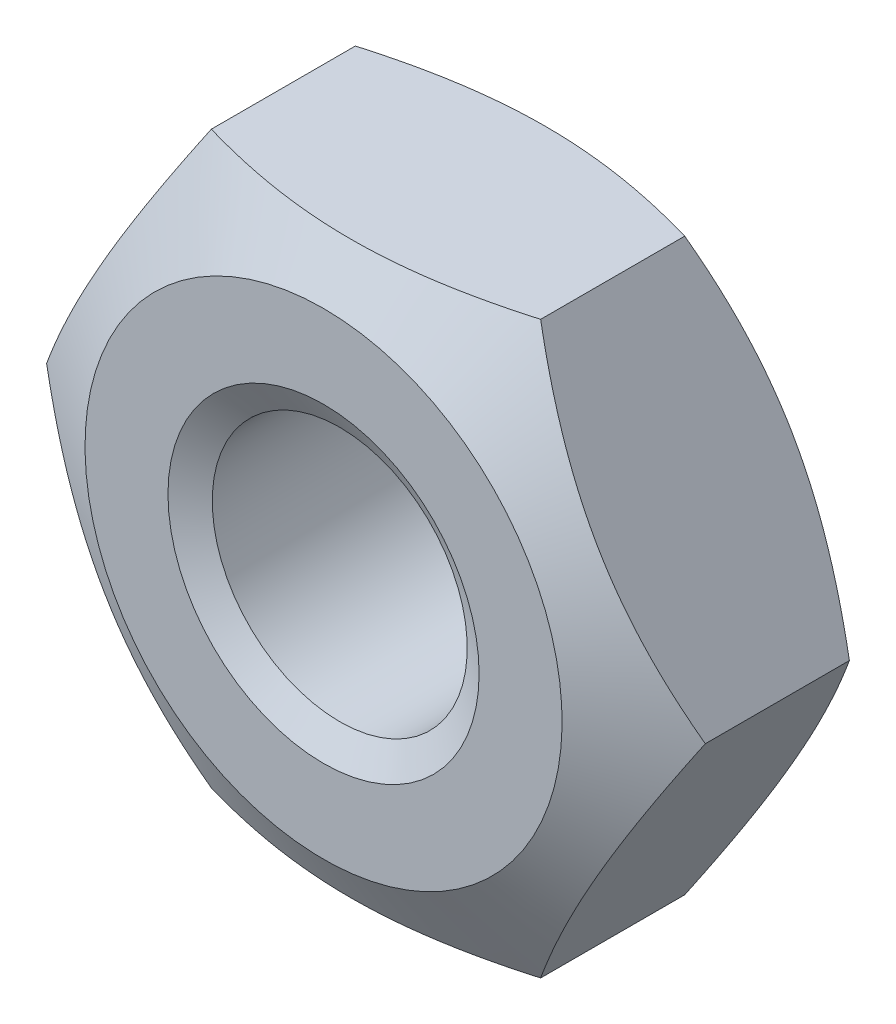
ISO-10303-21;
HEADER;
FILE_DESCRIPTION(('STEP AP214'),'2;1');
FILE_NAME('part.step','',(''),(''),'','','');
FILE_SCHEMA(('AUTOMOTIVE_DESIGN { 1 0 10303 214 1 1 1 1 }'));
ENDSEC;
DATA;
#1=APPLICATION_CONTEXT('core data for automotive mechanical design processes');
#2=APPLICATION_PROTOCOL_DEFINITION('international standard','automotive_design',2000,#1);
#3=PRODUCT_CONTEXT('',#1,'mechanical');
#4=PRODUCT('Part','Part','',(#3));
#5=PRODUCT_RELATED_PRODUCT_CATEGORY('part','',(#4));
#6=PRODUCT_DEFINITION_FORMATION('','',#4);
#7=PRODUCT_DEFINITION_CONTEXT('part definition',#1,'design');
#8=PRODUCT_DEFINITION('design','',#6,#7);
#9=PRODUCT_DEFINITION_SHAPE('','',#8);
#10=(LENGTH_UNIT() NAMED_UNIT(*) SI_UNIT(.MILLI.,.METRE.));
#11=(NAMED_UNIT(*) PLANE_ANGLE_UNIT() SI_UNIT($,.RADIAN.));
#12=(NAMED_UNIT(*) SI_UNIT($,.STERADIAN.) SOLID_ANGLE_UNIT());
#13=UNCERTAINTY_MEASURE_WITH_UNIT(LENGTH_MEASURE(1.E-05),#10,'distance_accuracy_value','');
#14=(GEOMETRIC_REPRESENTATION_CONTEXT(3) GLOBAL_UNCERTAINTY_ASSIGNED_CONTEXT((#13)) GLOBAL_UNIT_ASSIGNED_CONTEXT((#10,
#11,#12)) REPRESENTATION_CONTEXT('',''));
#15=CARTESIAN_POINT('',(0.,0.,0.));
#16=DIRECTION('',(0.,0.,1.));
#17=DIRECTION('',(1.,0.,0.));
#18=AXIS2_PLACEMENT_3D('',#15,#16,#17);
#19=CARTESIAN_POINT('',(0.,0.,2.4));
#20=DIRECTION('',(0.,0.,-1.));
#21=DIRECTION('',(0.,1.,0.));
#22=AXIS2_PLACEMENT_3D('',#19,#20,#21);
#23=CONICAL_SURFACE('',#22,2.3,1.0471975511966);
#24=CARTESIAN_POINT('',(0.,0.,2.4));
#25=DIRECTION('',(0.,0.,-1.));
#26=DIRECTION('',(0.,1.,0.));
#27=AXIS2_PLACEMENT_3D('',#24,#25,#26);
#28=CIRCLE('',#27,2.3);
#29=CARTESIAN_POINT('',(0.,2.3,2.4));
#30=VERTEX_POINT('',#29);
#31=EDGE_CURVE('E11',#30,#30,#28,.T.);
#32=ORIENTED_EDGE('',*,*,#31,.T.);
#33=EDGE_LOOP('',(#32));
#34=FACE_BOUND('',#33,.T.);
#35=CARTESIAN_POINT('',(1.58771208557094,-2.750002,1.89457161913578));
#36=CARTESIAN_POINT('',(1.65748248642851,-2.62915612085022,1.93486529934376));
#37=CARTESIAN_POINT('',(1.72785514435081,-2.50726710186514,1.97151030104183));
#38=CARTESIAN_POINT('',(1.86981891728232,-2.26137863431358,2.03547307009298));
#39=CARTESIAN_POINT('',(1.94141255390371,-2.13737481818672,2.06276821227955));
#40=CARTESIAN_POINT('',(2.08371260251193,-1.89090390407776,2.1052550952032));
#41=CARTESIAN_POINT('',(2.15439712586623,-1.76847471831933,2.12072964221875));
#42=CARTESIAN_POINT('',(2.29609859538076,-1.52304057361298,2.13919961267864));
#43=CARTESIAN_POINT('',(2.36711502684345,-1.40003650614738,2.14221033447679));
#44=CARTESIAN_POINT('',(2.49980176277018,-1.17021633803182,2.13593121782755));
#45=CARTESIAN_POINT('',(2.56149197732857,-1.06336575208685,2.12818311070257));
#46=CARTESIAN_POINT('',(2.68447051456143,-0.850360677359029,2.10363105932215));
#47=CARTESIAN_POINT('',(2.74575841219916,-0.744206924761402,2.08681873623359));
#48=CARTESIAN_POINT('',(2.8689902995889,-0.530763034689772,2.04479115688163));
#49=CARTESIAN_POINT('',(2.93091870044305,-0.423499897978883,2.01939783046528));
#50=CARTESIAN_POINT('',(3.05385210387221,-0.210572997292224,1.96176570505346));
#51=CARTESIAN_POINT('',(3.1148586801678,-0.104906507552423,1.92954043874009));
#52=CARTESIAN_POINT('',(3.17542763524348,2.00000000042138E-06,1.89457161913578));
#53=B_SPLINE_CURVE_WITH_KNOTS('',3,(#35,#36,#37,#38,#39,#40,#41,#42,#43,#44,#45,#46,#47,#48,#49,
#50,#51,#52),.UNSPECIFIED.,.F.,.F.,(4,2,2,2,2,2,2,2,4),(0.,0.435897174011015,0.872841818983071,
1.29897342204202,1.72458182710172,2.0950998279895,2.46596091919292,2.84504596377344,
3.22338701890322),.UNSPECIFIED.);
#54=CARTESIAN_POINT('',(1.58771324027147,-2.75,1.8945722858028));
#55=VERTEX_POINT('',#54);
#56=CARTESIAN_POINT('',(3.17542648054294,0.,1.8945722858028));
#57=VERTEX_POINT('',#56);
#58=EDGE_CURVE('E182',#55,#57,#53,.T.);
#59=ORIENTED_EDGE('',*,*,#58,.T.);
#60=CARTESIAN_POINT('',(3.17542763524348,-1.99999999977462E-06,1.89457161913578));
#61=CARTESIAN_POINT('',(3.1056572343859,0.120843879149777,1.93486529934376));
#62=CARTESIAN_POINT('',(3.0352845764636,0.242732898134863,1.97151030104182));
#63=CARTESIAN_POINT('',(2.89332080353209,0.488621365686415,2.03547307009298));
#64=CARTESIAN_POINT('',(2.8217271669107,0.612625181813277,2.06276821227955));
#65=CARTESIAN_POINT('',(2.67942711830248,0.859096095922241,2.1052550952032));
#66=CARTESIAN_POINT('',(2.60874259494818,0.981525281680672,2.12072964221874));
#67=CARTESIAN_POINT('',(2.46704112543365,1.22695942638702,2.13919961267864));
#68=CARTESIAN_POINT('',(2.39602469397096,1.34996349385262,2.14221033447679));
#69=CARTESIAN_POINT('',(2.26333795804424,1.57978366196818,2.13593121782755));
#70=CARTESIAN_POINT('',(2.20164774348584,1.68663424791315,2.12818311070257));
#71=CARTESIAN_POINT('',(2.07866920625298,1.89963932264097,2.10363105932215));
#72=CARTESIAN_POINT('',(2.01738130861525,2.0057930752386,2.08681873623358));
#73=CARTESIAN_POINT('',(1.89414942122551,2.21923696531023,2.04479115688163));
#74=CARTESIAN_POINT('',(1.83222102037136,2.32650010202112,2.01939783046528));
#75=CARTESIAN_POINT('',(1.7092876169422,2.53942700270778,1.96176570505346));
#76=CARTESIAN_POINT('',(1.6482810406466,2.64509349244758,1.92954043874009));
#77=CARTESIAN_POINT('',(1.58771208557093,2.750002,1.89457161913578));
#78=B_SPLINE_CURVE_WITH_KNOTS('',3,(#60,#61,#62,#63,#64,#65,#66,#67,#68,#69,#70,#71,#72,#73,#74,
#75,#76,#77),.UNSPECIFIED.,.F.,.F.,(4,2,2,2,2,2,2,2,4),(0.,0.435897174011014,0.87284181898307,
1.29897342204202,1.72458182710171,2.0950998279895,2.46596091919292,2.84504596377344,
3.22338701890322),.UNSPECIFIED.);
#79=CARTESIAN_POINT('',(1.58771324027147,2.75,1.8945722858028));
#80=VERTEX_POINT('',#79);
#81=EDGE_CURVE('E33',#57,#80,#78,.T.);
#82=ORIENTED_EDGE('',*,*,#81,.T.);
#83=CARTESIAN_POINT('',(-4.17492078268514,2.75,0.841589423608449));
#84=CARTESIAN_POINT('',(-4.0555236361547,2.75,0.899140343900183));
#85=CARTESIAN_POINT('',(-3.93584251198962,2.75,0.956112732187948));
#86=CARTESIAN_POINT('',(-3.69576089934294,2.75,1.06857306723055));
#87=CARTESIAN_POINT('',(-3.57536029222631,2.75,1.12406076042277));
#88=CARTESIAN_POINT('',(-3.33302371475266,2.75,1.23352302218842));
#89=CARTESIAN_POINT('',(-3.21108288478636,2.75,1.28748687129436));
#90=CARTESIAN_POINT('',(-2.96619916431993,2.75,1.39308219112652));
#91=CARTESIAN_POINT('',(-2.8432563243911,2.75,1.44471377871169));
#92=CARTESIAN_POINT('',(-2.59258941303777,2.75,1.54648056103766));
#93=CARTESIAN_POINT('',(-2.4648299751017,2.75,1.59652914069232));
#94=CARTESIAN_POINT('',(-2.20778361967116,2.75,1.69261605204732));
#95=CARTESIAN_POINT('',(-2.07849652809647,2.75,1.7386539216128));
#96=CARTESIAN_POINT('',(-1.81846171675073,2.75,1.82544460445463));
#97=CARTESIAN_POINT('',(-1.68771788469469,2.75,1.86620894348865));
#98=CARTESIAN_POINT('',(-1.42435808131017,2.75,1.94108584694019));
#99=CARTESIAN_POINT('',(-1.29174274260596,2.75,1.97520060396712));
#100=CARTESIAN_POINT('',(-1.02527164613574,2.75,2.03491016921893));
#101=CARTESIAN_POINT('',(-0.891425472148801,2.75,2.06054693529163));
#102=CARTESIAN_POINT('',(-0.622167574603205,2.75,2.1017877255108));
#103=CARTESIAN_POINT('',(-0.486755972077009,2.75,2.11739252007626));
#104=CARTESIAN_POINT('',(-0.216772380151735,2.75,2.13711956080218));
#105=CARTESIAN_POINT('',(-0.0822109100262833,2.75,2.14138227280258));
#106=CARTESIAN_POINT('',(0.186794515805717,2.75,2.13842845481557));
#107=CARTESIAN_POINT('',(0.321238466679458,2.75,2.13121147309044));
#108=CARTESIAN_POINT('',(0.552235894211765,2.75,2.10944456774496));
#109=CARTESIAN_POINT('',(0.649043641588239,2.75,2.09745644996773));
#110=CARTESIAN_POINT('',(0.841887809690352,2.75,2.06832557903341));
#111=CARTESIAN_POINT('',(0.93792411149775,2.75,2.05118204625167));
#112=CARTESIAN_POINT('',(1.22477021877881,2.75,1.99292358111716));
#113=CARTESIAN_POINT('',(1.4141976742187,2.75,1.94499346737052));
#114=CARTESIAN_POINT('',(1.79316999369538,2.75,1.8348965675731));
#115=CARTESIAN_POINT('',(1.98262859308925,2.75,1.77244399697407));
#116=CARTESIAN_POINT('',(2.26420905920556,2.75,1.67171392543));
#117=CARTESIAN_POINT('',(2.3576225093184,2.75,1.63696707344137));
#118=CARTESIAN_POINT('',(2.54369060437376,2.75,1.56549762990345));
#119=CARTESIAN_POINT('',(2.63634525656934,2.75,1.52877505726482));
#120=CARTESIAN_POINT('',(2.84782797782415,2.75,1.4427751645851));
#121=CARTESIAN_POINT('',(2.96643335047433,2.75,1.39295191641168));
#122=CARTESIAN_POINT('',(3.2027072466218,2.75,1.2911267326645));
#123=CARTESIAN_POINT('',(3.32037572743306,2.75,1.23912469849071));
#124=CARTESIAN_POINT('',(3.67224319990006,2.75,1.08050060536942));
#125=CARTESIAN_POINT('',(3.9052675440996,2.75,0.97127580177626));
#126=CARTESIAN_POINT('',(4.36929432377212,2.75,0.748149399639753));
#127=CARTESIAN_POINT('',(4.60029481794165,2.75,0.634243804116133));
#128=CARTESIAN_POINT('',(5.06069895101183,2.75,0.403239495045267));
#129=CARTESIAN_POINT('',(5.29010253909397,2.75,0.286140680457693));
#130=CARTESIAN_POINT('',(5.72981558557303,2.75,0.0589151776336782));
#131=CARTESIAN_POINT('',(5.94021407269475,2.75,-0.0510397826978796));
#132=CARTESIAN_POINT('',(6.36024235687984,2.75,-0.272421189544509));
#133=CARTESIAN_POINT('',(6.56987213170991,2.75000000000001,-0.383847678198026));
#134=CARTESIAN_POINT('',(6.98807914887459,2.75000000000001,-0.607590004022612));
#135=CARTESIAN_POINT('',(7.19665768342921,2.75000000000001,-0.719903429271202));
#136=CARTESIAN_POINT('',(7.61331937316584,2.75000000000001,-0.945422330376072));
#137=CARTESIAN_POINT('',(7.82140255135192,2.75,-1.05862776371257));
#138=CARTESIAN_POINT('',(8.02930135054041,2.75,-1.17216853600988));
#139=B_SPLINE_CURVE_WITH_KNOTS('',3,(#83,#84,#85,#86,#87,#88,#89,#90,#91,#92,#93,#94,#95,#96,
#97,#98,#99,#100,#101,#102,#103,#104,#105,#106,#107,#108,#109,#110,#111,#112,#113,#114,#115,
#116,#117,#118,#119,#120,#121,#122,#123,#124,#125,#126,#127,#128,#129,#130,#131,#132,#133,#134,
#135,#136,#137,#138),.UNSPECIFIED.,.F.,.F.,(4,2,2,2,2,2,2,2,2,2,2,2,2,2,2,2,2,2,2,2,2,2,2,2,2,2,
2,4),(0.,0.397635909565538,0.795339301167408,1.19536350987136,1.59536765291199,2.00695387312436,
2.41858745588699,2.8293056057597,3.23988809694291,3.64840708352782,4.05689469358898,
4.46029932467151,4.86371983053315,5.15621888042224,5.44876218557306,6.03420781043152,
6.63232960954207,6.9313117535824,7.23029103641778,7.61619859128341,8.00212362913258,
8.77409280977921,9.54673546896313,10.3194026046583,11.0315885733004,11.7437949803965,
12.4544780853662,13.165127516363),.UNSPECIFIED.);
#140=CARTESIAN_POINT('',(-1.58771324027147,2.75,1.8945722858028));
#141=VERTEX_POINT('',#140);
#142=EDGE_CURVE('E76',#80,#141,#139,.F.);
#143=ORIENTED_EDGE('',*,*,#142,.T.);
#144=CARTESIAN_POINT('',(-1.58771208557094,2.750002,1.89457161913578));
#145=CARTESIAN_POINT('',(-1.65748248642851,2.62915612085022,1.93486529934376));
#146=CARTESIAN_POINT('',(-1.72785514435081,2.50726710186514,1.97151030104182));
#147=CARTESIAN_POINT('',(-1.86981891728232,2.26137863431358,2.03547307009298));
#148=CARTESIAN_POINT('',(-1.94141255390371,2.13737481818672,2.06276821227955));
#149=CARTESIAN_POINT('',(-2.08371260251193,1.89090390407776,2.1052550952032));
#150=CARTESIAN_POINT('',(-2.15439712586623,1.76847471831933,2.12072964221875));
#151=CARTESIAN_POINT('',(-2.29609859538076,1.52304057361298,2.13919961267864));
#152=CARTESIAN_POINT('',(-2.36711502684345,1.40003650614738,2.14221033447679));
#153=CARTESIAN_POINT('',(-2.49980176277018,1.17021633803182,2.13593121782755));
#154=CARTESIAN_POINT('',(-2.56149197732857,1.06336575208685,2.12818311070257));
#155=CARTESIAN_POINT('',(-2.68447051456143,0.850360677359028,2.10363105932215));
#156=CARTESIAN_POINT('',(-2.74575841219916,0.744206924761401,2.08681873623359));
#157=CARTESIAN_POINT('',(-2.8689902995889,0.530763034689772,2.04479115688163));
#158=CARTESIAN_POINT('',(-2.93091870044305,0.423499897978883,2.01939783046528));
#159=CARTESIAN_POINT('',(-3.05385210387221,0.210572997292224,1.96176570505346));
#160=CARTESIAN_POINT('',(-3.1148586801678,0.104906507552423,1.92954043874009));
#161=CARTESIAN_POINT('',(-3.17542763524348,-2.00000000069806E-06,1.89457161913578));
#162=B_SPLINE_CURVE_WITH_KNOTS('',3,(#144,#145,#146,#147,#148,#149,#150,#151,#152,#153,#154,
#155,#156,#157,#158,#159,#160,#161),.UNSPECIFIED.,.F.,.F.,(4,2,2,2,2,2,2,2,4),(0.,
0.435897174011015,0.872841818983071,1.29897342204202,1.72458182710172,2.0950998279895,
2.46596091919292,2.84504596377344,3.22338701890322),.UNSPECIFIED.);
#163=CARTESIAN_POINT('',(-3.17542648054294,0.,1.8945722858028));
#164=VERTEX_POINT('',#163);
#165=EDGE_CURVE('E87',#141,#164,#162,.T.);
#166=ORIENTED_EDGE('',*,*,#165,.T.);
#167=CARTESIAN_POINT('',(-3.17542763524348,1.99999999947583E-06,1.89457161913578));
#168=CARTESIAN_POINT('',(-3.1056572343859,-0.120843879149777,1.93486529934376));
#169=CARTESIAN_POINT('',(-3.0352845764636,-0.242732898134862,1.97151030104182));
#170=CARTESIAN_POINT('',(-2.89332080353209,-0.488621365686415,2.03547307009298));
#171=CARTESIAN_POINT('',(-2.8217271669107,-0.612625181813276,2.06276821227955));
#172=CARTESIAN_POINT('',(-2.67942711830248,-0.85909609592224,2.1052550952032));
#173=CARTESIAN_POINT('',(-2.60874259494818,-0.981525281680671,2.12072964221874));
#174=CARTESIAN_POINT('',(-2.46704112543365,-1.22695942638702,2.13919961267864));
#175=CARTESIAN_POINT('',(-2.39602469397096,-1.34996349385262,2.14221033447679));
#176=CARTESIAN_POINT('',(-2.26333795804424,-1.57978366196818,2.13593121782755));
#177=CARTESIAN_POINT('',(-2.20164774348584,-1.68663424791315,2.12818311070257));
#178=CARTESIAN_POINT('',(-2.07866920625298,-1.89963932264097,2.10363105932215));
#179=CARTESIAN_POINT('',(-2.01738130861525,-2.0057930752386,2.08681873623358));
#180=CARTESIAN_POINT('',(-1.89414942122551,-2.21923696531023,2.04479115688163));
#181=CARTESIAN_POINT('',(-1.83222102037136,-2.32650010202111,2.01939783046528));
#182=CARTESIAN_POINT('',(-1.7092876169422,-2.53942700270778,1.96176570505346));
#183=CARTESIAN_POINT('',(-1.64828104064661,-2.64509349244758,1.92954043874009));
#184=CARTESIAN_POINT('',(-1.58771208557093,-2.750002,1.89457161913578));
#185=B_SPLINE_CURVE_WITH_KNOTS('',3,(#167,#168,#169,#170,#171,#172,#173,#174,#175,#176,#177,
#178,#179,#180,#181,#182,#183,#184),.UNSPECIFIED.,.F.,.F.,(4,2,2,2,2,2,2,2,4),(0.,
0.435897174011014,0.87284181898307,1.29897342204202,1.72458182710171,2.0950998279895,
2.46596091919292,2.84504596377344,3.22338701890322),.UNSPECIFIED.);
#186=CARTESIAN_POINT('',(-1.58771324027147,-2.75,1.8945722858028));
#187=VERTEX_POINT('',#186);
#188=EDGE_CURVE('E93',#164,#187,#185,.T.);
#189=ORIENTED_EDGE('',*,*,#188,.T.);
#190=CARTESIAN_POINT('',(-4.17492078268514,-2.75,0.841589423608448));
#191=CARTESIAN_POINT('',(-4.0555236361547,-2.75,0.899140343900183));
#192=CARTESIAN_POINT('',(-3.93584251198962,-2.75,0.956112732187947));
#193=CARTESIAN_POINT('',(-3.69576089934294,-2.75,1.06857306723054));
#194=CARTESIAN_POINT('',(-3.57536029222631,-2.75,1.12406076042277));
#195=CARTESIAN_POINT('',(-3.33302371475266,-2.75,1.23352302218842));
#196=CARTESIAN_POINT('',(-3.21108288478636,-2.75,1.28748687129436));
#197=CARTESIAN_POINT('',(-2.96619916431993,-2.75,1.39308219112652));
#198=CARTESIAN_POINT('',(-2.8432563243911,-2.75,1.44471377871168));
#199=CARTESIAN_POINT('',(-2.59258941303777,-2.75,1.54648056103766));
#200=CARTESIAN_POINT('',(-2.4648299751017,-2.75,1.59652914069231));
#201=CARTESIAN_POINT('',(-2.20778361967116,-2.75,1.69261605204732));
#202=CARTESIAN_POINT('',(-2.07849652809647,-2.75,1.7386539216128));
#203=CARTESIAN_POINT('',(-1.81846171675073,-2.75,1.82544460445463));
#204=CARTESIAN_POINT('',(-1.68771788469469,-2.75,1.86620894348865));
#205=CARTESIAN_POINT('',(-1.42435808131017,-2.75,1.94108584694019));
#206=CARTESIAN_POINT('',(-1.29174274260596,-2.75,1.97520060396711));
#207=CARTESIAN_POINT('',(-1.02527164613574,-2.75,2.03491016921893));
#208=CARTESIAN_POINT('',(-0.891425472148801,-2.75,2.06054693529163));
#209=CARTESIAN_POINT('',(-0.622167574603205,-2.75,2.1017877255108));
#210=CARTESIAN_POINT('',(-0.486755972077009,-2.75,2.11739252007626));
#211=CARTESIAN_POINT('',(-0.216772380151734,-2.75,2.13711956080218));
#212=CARTESIAN_POINT('',(-0.0822109100262819,-2.75,2.14138227280258));
#213=CARTESIAN_POINT('',(0.186794515805718,-2.75,2.13842845481557));
#214=CARTESIAN_POINT('',(0.32123846667946,-2.75,2.13121147309044));
#215=CARTESIAN_POINT('',(0.552235894211767,-2.75,2.10944456774496));
#216=CARTESIAN_POINT('',(0.649043641588241,-2.75,2.09745644996773));
#217=CARTESIAN_POINT('',(0.841887809690353,-2.75,2.06832557903341));
#218=CARTESIAN_POINT('',(0.937924111497751,-2.75,2.05118204625167));
#219=CARTESIAN_POINT('',(1.22477021877881,-2.75,1.99292358111716));
#220=CARTESIAN_POINT('',(1.4141976742187,-2.75,1.94499346737052));
#221=CARTESIAN_POINT('',(1.79316999369538,-2.75,1.8348965675731));
#222=CARTESIAN_POINT('',(1.98262859308925,-2.75,1.77244399697407));
#223=CARTESIAN_POINT('',(2.26420905920556,-2.75,1.67171392543));
#224=CARTESIAN_POINT('',(2.3576225093184,-2.75,1.63696707344137));
#225=CARTESIAN_POINT('',(2.54369060437376,-2.75,1.56549762990345));
#226=CARTESIAN_POINT('',(2.63634525656934,-2.75,1.52877505726482));
#227=CARTESIAN_POINT('',(2.84782797782415,-2.75,1.4427751645851));
#228=CARTESIAN_POINT('',(2.96643335047433,-2.75,1.39295191641168));
#229=CARTESIAN_POINT('',(3.2027072466218,-2.75,1.2911267326645));
#230=CARTESIAN_POINT('',(3.32037572743306,-2.75,1.23912469849071));
#231=CARTESIAN_POINT('',(3.67224319990006,-2.75,1.08050060536942));
#232=CARTESIAN_POINT('',(3.9052675440996,-2.75,0.97127580177626));
#233=CARTESIAN_POINT('',(4.36929432377213,-2.75,0.748149399639753));
#234=CARTESIAN_POINT('',(4.60029481794165,-2.75,0.634243804116132));
#235=CARTESIAN_POINT('',(5.06069895101184,-2.75,0.403239495045267));
#236=CARTESIAN_POINT('',(5.29010253909397,-2.75,0.286140680457693));
#237=CARTESIAN_POINT('',(5.72981558557304,-2.75,0.0589151776336788));
#238=CARTESIAN_POINT('',(5.94021407269475,-2.75,-0.0510397826978791));
#239=CARTESIAN_POINT('',(6.36024235687984,-2.75,-0.272421189544508));
#240=CARTESIAN_POINT('',(6.56987213170991,-2.75,-0.383847678198024));
#241=CARTESIAN_POINT('',(6.98807914887459,-2.75,-0.60759000402261));
#242=CARTESIAN_POINT('',(7.1966576834292,-2.75,-0.719903429271199));
#243=CARTESIAN_POINT('',(7.61331937316584,-2.75,-0.94542233037607));
#244=CARTESIAN_POINT('',(7.82140255135192,-2.75,-1.05862776371257));
#245=CARTESIAN_POINT('',(8.02930135054041,-2.75,-1.17216853600988));
#246=B_SPLINE_CURVE_WITH_KNOTS('',3,(#190,#191,#192,#193,#194,#195,#196,#197,#198,#199,#200,
#201,#202,#203,#204,#205,#206,#207,#208,#209,#210,#211,#212,#213,#214,#215,#216,#217,#218,#219,
#220,#221,#222,#223,#224,#225,#226,#227,#228,#229,#230,#231,#232,#233,#234,#235,#236,#237,#238,
#239,#240,#241,#242,#243,#244,#245),.UNSPECIFIED.,.F.,.F.,(4,2,2,2,2,2,2,2,2,2,2,2,2,2,2,2,2,2,
2,2,2,2,2,2,2,2,2,4),(0.,0.397635909565538,0.795339301167407,1.19536350987136,1.59536765291199,
2.00695387312436,2.41858745588699,2.8293056057597,3.23988809694291,3.64840708352782,
4.05689469358898,4.46029932467151,4.86371983053316,5.15621888042224,5.44876218557307,
6.03420781043152,6.63232960954207,6.9313117535824,7.23029103641778,7.61619859128341,
8.00212362913258,8.77409280977922,9.54673546896313,10.3194026046583,11.0315885733004,
11.7437949803965,12.4544780853662,13.165127516363),.UNSPECIFIED.);
#247=EDGE_CURVE('E188',#187,#55,#246,.T.);
#248=ORIENTED_EDGE('',*,*,#247,.T.);
#249=EDGE_LOOP('',(#59,#82,#143,#166,#189,#248));
#250=FACE_BOUND('',#249,.T.);
#251=ADVANCED_FACE('F16',(#34,#250),#23,.T.);
#252=CARTESIAN_POINT('',(3.17542648054294,0.,2.4));
#253=DIRECTION('',(0.,0.,-1.));
#254=DIRECTION('',(0.,1.,0.));
#255=AXIS2_PLACEMENT_3D('',#252,#253,#254);
#256=PLANE('',#255);
#257=CARTESIAN_POINT('',(0.,0.,2.4));
#258=DIRECTION('',(0.,0.,1.));
#259=DIRECTION('',(0.,-1.,0.));
#260=AXIS2_PLACEMENT_3D('',#257,#258,#259);
#261=CIRCLE('',#260,1.5);
#262=CARTESIAN_POINT('',(0.,-1.5,2.4));
#263=VERTEX_POINT('',#262);
#264=EDGE_CURVE('E104',#263,#263,#261,.T.);
#265=ORIENTED_EDGE('',*,*,#264,.F.);
#266=EDGE_LOOP('',(#265));
#267=FACE_BOUND('',#266,.T.);
#268=ORIENTED_EDGE('',*,*,#31,.F.);
#269=EDGE_LOOP('',(#268));
#270=FACE_BOUND('',#269,.T.);
#271=ADVANCED_FACE('F210',(#267,#270),#256,.F.);
#272=CARTESIAN_POINT('',(1.58771324027147,2.75,0.));
#273=DIRECTION('',(-0.866025403784438,-0.5,0.));
#274=DIRECTION('',(-0.5,0.866025403784439,0.));
#275=AXIS2_PLACEMENT_3D('',#272,#273,#274);
#276=PLANE('',#275);
#277=ORIENTED_EDGE('',*,*,#81,.F.);
#278=DIRECTION('',(0.,0.,1.));
#279=VECTOR('',#278,1.);
#280=CARTESIAN_POINT('',(3.17542648054294,0.,0.));
#281=LINE('',#280,#279);
#282=CARTESIAN_POINT('',(3.17542648054294,0.,0.505427714197194));
#283=VERTEX_POINT('',#282);
#284=EDGE_CURVE('E26',#283,#57,#281,.T.);
#285=ORIENTED_EDGE('',*,*,#284,.F.);
#286=CARTESIAN_POINT('',(1.58771208557093,2.750002,0.505428380864224));
#287=CARTESIAN_POINT('',(1.65748248642851,2.62915612085022,0.465134700656245));
#288=CARTESIAN_POINT('',(1.72785514435081,2.50726710186514,0.428489698958177));
#289=CARTESIAN_POINT('',(1.86981891728232,2.26137863431359,0.364526929907026));
#290=CARTESIAN_POINT('',(1.94141255390371,2.13737481818672,0.33723178772045));
#291=CARTESIAN_POINT('',(2.08371260251193,1.89090390407776,0.294744904796806));
#292=CARTESIAN_POINT('',(2.15439712586623,1.76847471831933,0.279270357781257));
#293=CARTESIAN_POINT('',(2.29609859538076,1.52304057361299,0.260800387321361));
#294=CARTESIAN_POINT('',(2.36711502684345,1.40003650614739,0.257789665523215));
#295=CARTESIAN_POINT('',(2.49980176277017,1.17021633803182,0.264068782172454));
#296=CARTESIAN_POINT('',(2.56149197732857,1.06336575208685,0.271816889297434));
#297=CARTESIAN_POINT('',(2.68447051456143,0.850360677359034,0.296368940677851));
#298=CARTESIAN_POINT('',(2.74575841219916,0.744206924761406,0.313181263766416));
#299=CARTESIAN_POINT('',(2.8689902995889,0.530763034689776,0.35520884311837));
#300=CARTESIAN_POINT('',(2.93091870044305,0.423499897978887,0.380602169534718));
#301=CARTESIAN_POINT('',(3.05385210387221,0.210572997292227,0.438234294946545));
#302=CARTESIAN_POINT('',(3.11485868016781,0.104906507552426,0.470459561259913));
#303=CARTESIAN_POINT('',(3.17542763524348,-1.99999999956551E-06,0.505428380864224));
#304=B_SPLINE_CURVE_WITH_KNOTS('',3,(#286,#287,#288,#289,#290,#291,#292,#293,#294,#295,#296,
#297,#298,#299,#300,#301,#302,#303),.UNSPECIFIED.,.F.,.F.,(4,2,2,2,2,2,2,2,4),(0.,
0.435897174011013,0.872841818983068,1.29897342204202,1.72458182710171,2.0950998279895,
2.46596091919292,2.84504596377344,3.22338701890322),.UNSPECIFIED.);
#305=CARTESIAN_POINT('',(1.58771324027147,2.75,0.505427714197194));
#306=VERTEX_POINT('',#305);
#307=EDGE_CURVE('E171',#306,#283,#304,.T.);
#308=ORIENTED_EDGE('',*,*,#307,.F.);
#309=DIRECTION('',(0.,0.,1.));
#310=VECTOR('',#309,1.);
#311=CARTESIAN_POINT('',(1.58771324027147,2.75,0.));
#312=LINE('',#311,#310);
#313=EDGE_CURVE('E83',#306,#80,#312,.T.);
#314=ORIENTED_EDGE('',*,*,#313,.T.);
#315=EDGE_LOOP('',(#277,#285,#308,#314));
#316=FACE_BOUND('',#315,.T.);
#317=ADVANCED_FACE('F18',(#316),#276,.F.);
#318=CARTESIAN_POINT('',(3.17542648054294,0.,0.));
#319=DIRECTION('',(-0.866025403784439,0.5,0.));
#320=DIRECTION('',(0.5,0.866025403784439,0.));
#321=AXIS2_PLACEMENT_3D('',#318,#319,#320);
#322=PLANE('',#321);
#323=ORIENTED_EDGE('',*,*,#58,.F.);
#324=DIRECTION('',(0.,0.,1.));
#325=VECTOR('',#324,1.);
#326=CARTESIAN_POINT('',(1.58771324027147,-2.75,0.));
#327=LINE('',#326,#325);
#328=CARTESIAN_POINT('',(1.58771324027147,-2.75,0.505427714197194));
#329=VERTEX_POINT('',#328);
#330=EDGE_CURVE('E381',#329,#55,#327,.T.);
#331=ORIENTED_EDGE('',*,*,#330,.F.);
#332=CARTESIAN_POINT('',(3.17542763524348,2.00000000036615E-06,0.505428380864225));
#333=CARTESIAN_POINT('',(3.1056572343859,-0.120843879149776,0.465134700656244));
#334=CARTESIAN_POINT('',(3.0352845764636,-0.242732898134862,0.428489698958176));
#335=CARTESIAN_POINT('',(2.89332080353209,-0.488621365686414,0.364526929907024));
#336=CARTESIAN_POINT('',(2.8217271669107,-0.612625181813276,0.337231787720449));
#337=CARTESIAN_POINT('',(2.67942711830248,-0.85909609592224,0.294744904796804));
#338=CARTESIAN_POINT('',(2.60874259494818,-0.981525281680671,0.279270357781256));
#339=CARTESIAN_POINT('',(2.46704112543365,-1.22695942638702,0.26080038732136));
#340=CARTESIAN_POINT('',(2.39602469397096,-1.34996349385262,0.257789665523215));
#341=CARTESIAN_POINT('',(2.26333795804424,-1.57978366196818,0.264068782172454));
#342=CARTESIAN_POINT('',(2.20164774348584,-1.68663424791315,0.271816889297433));
#343=CARTESIAN_POINT('',(2.07866920625298,-1.89963932264097,0.29636894067785));
#344=CARTESIAN_POINT('',(2.01738130861525,-2.00579307523859,0.313181263766415));
#345=CARTESIAN_POINT('',(1.89414942122551,-2.21923696531022,0.355208843118369));
#346=CARTESIAN_POINT('',(1.83222102037136,-2.32650010202111,0.380602169534717));
#347=CARTESIAN_POINT('',(1.7092876169422,-2.53942700270777,0.438234294946544));
#348=CARTESIAN_POINT('',(1.64828104064661,-2.64509349244757,0.470459561259912));
#349=CARTESIAN_POINT('',(1.58771208557094,-2.750002,0.505428380864224));
#350=B_SPLINE_CURVE_WITH_KNOTS('',3,(#332,#333,#334,#335,#336,#337,#338,#339,#340,#341,#342,
#343,#344,#345,#346,#347,#348,#349),.UNSPECIFIED.,.F.,.F.,(4,2,2,2,2,2,2,2,4),(0.,
0.435897174011015,0.87284181898307,1.29897342204202,1.72458182710171,2.0950998279895,
2.46596091919292,2.84504596377344,3.22338701890322),.UNSPECIFIED.);
#351=EDGE_CURVE('E40',#283,#329,#350,.T.);
#352=ORIENTED_EDGE('',*,*,#351,.F.);
#353=ORIENTED_EDGE('',*,*,#284,.T.);
#354=EDGE_LOOP('',(#323,#331,#352,#353));
#355=FACE_BOUND('',#354,.T.);
#356=ADVANCED_FACE('F176',(#355),#322,.F.);
#357=CARTESIAN_POINT('',(1.58771324027147,-2.75,0.));
#358=DIRECTION('',(0.,1.,0.));
#359=DIRECTION('',(1.,0.,0.));
#360=AXIS2_PLACEMENT_3D('',#357,#358,#359);
#361=PLANE('',#360);
#362=ORIENTED_EDGE('',*,*,#247,.F.);
#363=DIRECTION('',(0.,0.,1.));
#364=VECTOR('',#363,1.);
#365=CARTESIAN_POINT('',(-1.58771324027147,-2.75,0.));
#366=LINE('',#365,#364);
#367=CARTESIAN_POINT('',(-1.58771324027147,-2.75,0.505427714197194));
#368=VERTEX_POINT('',#367);
#369=EDGE_CURVE('E372',#368,#187,#366,.T.);
#370=ORIENTED_EDGE('',*,*,#369,.F.);
#371=CARTESIAN_POINT('',(-4.17492078268514,-2.75,1.55841057639155));
#372=CARTESIAN_POINT('',(-4.0555236361547,-2.75,1.50085965609982));
#373=CARTESIAN_POINT('',(-3.93584251198961,-2.75,1.44388726781205));
#374=CARTESIAN_POINT('',(-3.69576089934294,-2.75,1.33142693276946));
#375=CARTESIAN_POINT('',(-3.57536029222631,-2.75,1.27593923957723));
#376=CARTESIAN_POINT('',(-3.33302371475265,-2.75,1.16647697781158));
#377=CARTESIAN_POINT('',(-3.21108288478636,-2.75,1.11251312870564));
#378=CARTESIAN_POINT('',(-2.96619916431993,-2.75,1.00691780887348));
#379=CARTESIAN_POINT('',(-2.8432563243911,-2.75,0.955286221288315));
#380=CARTESIAN_POINT('',(-2.59258941303777,-2.75,0.853519438962343));
#381=CARTESIAN_POINT('',(-2.4648299751017,-2.75,0.803470859307685));
#382=CARTESIAN_POINT('',(-2.20778361967115,-2.75,0.707383947952681));
#383=CARTESIAN_POINT('',(-2.07849652809647,-2.75,0.661346078387201));
#384=CARTESIAN_POINT('',(-1.81846171675073,-2.75,0.574555395545368));
#385=CARTESIAN_POINT('',(-1.68771788469469,-2.75,0.533791056511349));
#386=CARTESIAN_POINT('',(-1.42435808131017,-2.75,0.458914153059809));
#387=CARTESIAN_POINT('',(-1.29174274260596,-2.75,0.424799396032887));
#388=CARTESIAN_POINT('',(-1.02527164613574,-2.75,0.365089830781071));
#389=CARTESIAN_POINT('',(-0.891425472148799,-2.75,0.339453064708372));
#390=CARTESIAN_POINT('',(-0.622167574603203,-2.75,0.298212274489197));
#391=CARTESIAN_POINT('',(-0.486755972077007,-2.75,0.282607479923735));
#392=CARTESIAN_POINT('',(-0.216772380151733,-2.75,0.262880439197816));
#393=CARTESIAN_POINT('',(-0.0822109100262815,-2.75,0.258617727197423));
#394=CARTESIAN_POINT('',(0.186794515805718,-2.75,0.261571545184429));
#395=CARTESIAN_POINT('',(0.32123846667946,-2.75,0.268788526909561));
#396=CARTESIAN_POINT('',(0.552235894211767,-2.75,0.290555432255039));
#397=CARTESIAN_POINT('',(0.649043641588241,-2.75,0.302543550032271));
#398=CARTESIAN_POINT('',(0.841887809690354,-2.75,0.331674420966594));
#399=CARTESIAN_POINT('',(0.937924111497753,-2.75,0.348817953748328));
#400=CARTESIAN_POINT('',(1.22477021877882,-2.75,0.407076418882841));
#401=CARTESIAN_POINT('',(1.4141976742187,-2.75,0.455006532629482));
#402=CARTESIAN_POINT('',(1.79316999369538,-2.75,0.565103432426902));
#403=CARTESIAN_POINT('',(1.98262859308925,-2.75,0.627556003025932));
#404=CARTESIAN_POINT('',(2.26420905920556,-2.75,0.728286074569998));
#405=CARTESIAN_POINT('',(2.35762250931841,-2.75,0.763032926558635));
#406=CARTESIAN_POINT('',(2.54369060437376,-2.75,0.834502370096554));
#407=CARTESIAN_POINT('',(2.63634525656934,-2.75,0.871224942735184));
#408=CARTESIAN_POINT('',(2.84782797782415,-2.75,0.957224835414904));
#409=CARTESIAN_POINT('',(2.96643335047433,-2.75,1.00704808358832));
#410=CARTESIAN_POINT('',(3.2027072466218,-2.75,1.1088732673355));
#411=CARTESIAN_POINT('',(3.32037572743307,-2.75,1.1608753015093));
#412=CARTESIAN_POINT('',(3.67224319990006,-2.75,1.31949939463058));
#413=CARTESIAN_POINT('',(3.9052675440996,-2.75,1.42872419822374));
#414=CARTESIAN_POINT('',(4.36929432377213,-2.75,1.65185060036025));
#415=CARTESIAN_POINT('',(4.60029481794165,-2.75,1.76575619588387));
#416=CARTESIAN_POINT('',(5.06069895101184,-2.75,1.99676050495473));
#417=CARTESIAN_POINT('',(5.29010253909397,-2.75,2.11385931954231));
#418=CARTESIAN_POINT('',(5.72981558557303,-2.75,2.34108482236632));
#419=CARTESIAN_POINT('',(5.94021407269475,-2.75,2.45103978269788));
#420=CARTESIAN_POINT('',(6.36024235687984,-2.75,2.67242118954451));
#421=CARTESIAN_POINT('',(6.56987213170991,-2.75,2.78384767819802));
#422=CARTESIAN_POINT('',(6.98807914887459,-2.75,3.00759000402261));
#423=CARTESIAN_POINT('',(7.1966576834292,-2.75,3.1199034292712));
#424=CARTESIAN_POINT('',(7.61331937316584,-2.75,3.34542233037607));
#425=CARTESIAN_POINT('',(7.82140255135192,-2.75,3.45862776371257));
#426=CARTESIAN_POINT('',(8.02930135054041,-2.75,3.57216853600988));
#427=B_SPLINE_CURVE_WITH_KNOTS('',3,(#371,#372,#373,#374,#375,#376,#377,#378,#379,#380,#381,
#382,#383,#384,#385,#386,#387,#388,#389,#390,#391,#392,#393,#394,#395,#396,#397,#398,#399,#400,
#401,#402,#403,#404,#405,#406,#407,#408,#409,#410,#411,#412,#413,#414,#415,#416,#417,#418,#419,
#420,#421,#422,#423,#424,#425,#426),.UNSPECIFIED.,.F.,.F.,(4,2,2,2,2,2,2,2,2,2,2,2,2,2,2,2,2,2,
2,2,2,2,2,2,2,2,2,4),(0.,0.397635909565539,0.795339301167409,1.19536350987137,1.59536765291199,
2.00695387312436,2.41858745588699,2.8293056057597,3.23988809694291,3.64840708352782,
4.05689469358898,4.46029932467151,4.86371983053316,5.15621888042224,5.44876218557307,
6.03420781043152,6.63232960954208,6.9313117535824,7.23029103641779,7.61619859128341,
8.00212362913258,8.77409280977921,9.54673546896313,10.3194026046583,11.0315885733003,
11.7437949803965,12.4544780853662,13.165127516363),.UNSPECIFIED.);
#428=EDGE_CURVE('E161',#329,#368,#427,.F.);
#429=ORIENTED_EDGE('',*,*,#428,.F.);
#430=ORIENTED_EDGE('',*,*,#330,.T.);
#431=EDGE_LOOP('',(#362,#370,#429,#430));
#432=FACE_BOUND('',#431,.T.);
#433=ADVANCED_FACE('F179',(#432),#361,.F.);
#434=CARTESIAN_POINT('',(-1.58771324027147,-2.75,0.));
#435=DIRECTION('',(0.866025403784439,0.5,0.));
#436=DIRECTION('',(0.5,-0.866025403784439,0.));
#437=AXIS2_PLACEMENT_3D('',#434,#435,#436);
#438=PLANE('',#437);
#439=ORIENTED_EDGE('',*,*,#188,.F.);
#440=DIRECTION('',(0.,0.,1.));
#441=VECTOR('',#440,1.);
#442=CARTESIAN_POINT('',(-3.17542648054294,0.,0.));
#443=LINE('',#442,#441);
#444=CARTESIAN_POINT('',(-3.17542648054294,0.,0.505427714197194));
#445=VERTEX_POINT('',#444);
#446=EDGE_CURVE('E82',#445,#164,#443,.T.);
#447=ORIENTED_EDGE('',*,*,#446,.F.);
#448=CARTESIAN_POINT('',(-1.58771208557093,-2.750002,0.505428380864224));
#449=CARTESIAN_POINT('',(-1.65748248642851,-2.62915612085022,0.465134700656245));
#450=CARTESIAN_POINT('',(-1.72785514435081,-2.50726710186514,0.428489698958177));
#451=CARTESIAN_POINT('',(-1.86981891728232,-2.26137863431359,0.364526929907025));
#452=CARTESIAN_POINT('',(-1.94141255390371,-2.13737481818672,0.33723178772045));
#453=CARTESIAN_POINT('',(-2.08371260251193,-1.89090390407776,0.294744904796805));
#454=CARTESIAN_POINT('',(-2.15439712586623,-1.76847471831933,0.279270357781257));
#455=CARTESIAN_POINT('',(-2.29609859538076,-1.52304057361298,0.26080038732136));
#456=CARTESIAN_POINT('',(-2.36711502684345,-1.40003650614738,0.257789665523215));
#457=CARTESIAN_POINT('',(-2.49980176277017,-1.17021633803182,0.264068782172454));
#458=CARTESIAN_POINT('',(-2.56149197732857,-1.06336575208685,0.271816889297433));
#459=CARTESIAN_POINT('',(-2.68447051456143,-0.850360677359032,0.29636894067785));
#460=CARTESIAN_POINT('',(-2.74575841219916,-0.744206924761405,0.313181263766416));
#461=CARTESIAN_POINT('',(-2.8689902995889,-0.530763034689775,0.35520884311837));
#462=CARTESIAN_POINT('',(-2.93091870044305,-0.423499897978885,0.380602169534717));
#463=CARTESIAN_POINT('',(-3.05385210387221,-0.210572997292225,0.438234294946544));
#464=CARTESIAN_POINT('',(-3.11485868016781,-0.104906507552424,0.470459561259912));
#465=CARTESIAN_POINT('',(-3.17542763524348,2.00000000002178E-06,0.505428380864225));
#466=B_SPLINE_CURVE_WITH_KNOTS('',3,(#448,#449,#450,#451,#452,#453,#454,#455,#456,#457,#458,
#459,#460,#461,#462,#463,#464,#465),.UNSPECIFIED.,.F.,.F.,(4,2,2,2,2,2,2,2,4),(0.,
0.435897174011014,0.872841818983069,1.29897342204202,1.72458182710171,2.0950998279895,
2.46596091919292,2.84504596377344,3.22338701890322),.UNSPECIFIED.);
#467=EDGE_CURVE('E156',#368,#445,#466,.T.);
#468=ORIENTED_EDGE('',*,*,#467,.F.);
#469=ORIENTED_EDGE('',*,*,#369,.T.);
#470=EDGE_LOOP('',(#439,#447,#468,#469));
#471=FACE_BOUND('',#470,.T.);
#472=ADVANCED_FACE('F198',(#471),#438,.F.);
#473=CARTESIAN_POINT('',(-3.17542648054294,0.,0.));
#474=DIRECTION('',(0.866025403784439,-0.5,0.));
#475=DIRECTION('',(-0.5,-0.866025403784439,0.));
#476=AXIS2_PLACEMENT_3D('',#473,#474,#475);
#477=PLANE('',#476);
#478=ORIENTED_EDGE('',*,*,#165,.F.);
#479=DIRECTION('',(0.,0.,1.));
#480=VECTOR('',#479,1.);
#481=CARTESIAN_POINT('',(-1.58771324027147,2.75,0.));
#482=LINE('',#481,#480);
#483=CARTESIAN_POINT('',(-1.58771324027147,2.75,0.505427714197194));
#484=VERTEX_POINT('',#483);
#485=EDGE_CURVE('E72',#484,#141,#482,.T.);
#486=ORIENTED_EDGE('',*,*,#485,.F.);
#487=CARTESIAN_POINT('',(-3.17542763524348,-2.00000000050349E-06,0.505428380864225));
#488=CARTESIAN_POINT('',(-3.1056572343859,0.120843879149776,0.465134700656244));
#489=CARTESIAN_POINT('',(-3.0352845764636,0.242732898134861,0.428489698958176));
#490=CARTESIAN_POINT('',(-2.89332080353209,0.488621365686414,0.364526929907025));
#491=CARTESIAN_POINT('',(-2.8217271669107,0.612625181813276,0.33723178772045));
#492=CARTESIAN_POINT('',(-2.67942711830248,0.85909609592224,0.294744904796804));
#493=CARTESIAN_POINT('',(-2.60874259494818,0.98152528168067,0.279270357781256));
#494=CARTESIAN_POINT('',(-2.46704112543365,1.22695942638702,0.26080038732136));
#495=CARTESIAN_POINT('',(-2.39602469397096,1.34996349385262,0.257789665523215));
#496=CARTESIAN_POINT('',(-2.26333795804424,1.57978366196818,0.264068782172454));
#497=CARTESIAN_POINT('',(-2.20164774348584,1.68663424791315,0.271816889297433));
#498=CARTESIAN_POINT('',(-2.07866920625298,1.89963932264097,0.29636894067785));
#499=CARTESIAN_POINT('',(-2.01738130861525,2.00579307523859,0.313181263766415));
#500=CARTESIAN_POINT('',(-1.89414942122551,2.21923696531022,0.355208843118369));
#501=CARTESIAN_POINT('',(-1.83222102037136,2.32650010202111,0.380602169534717));
#502=CARTESIAN_POINT('',(-1.7092876169422,2.53942700270777,0.438234294946544));
#503=CARTESIAN_POINT('',(-1.64828104064661,2.64509349244757,0.470459561259912));
#504=CARTESIAN_POINT('',(-1.58771208557094,2.750002,0.505428380864224));
#505=B_SPLINE_CURVE_WITH_KNOTS('',3,(#487,#488,#489,#490,#491,#492,#493,#494,#495,#496,#497,
#498,#499,#500,#501,#502,#503,#504),.UNSPECIFIED.,.F.,.F.,(4,2,2,2,2,2,2,2,4),(0.,
0.435897174011014,0.87284181898307,1.29897342204202,1.72458182710171,2.0950998279895,
2.46596091919292,2.84504596377344,3.22338701890322),.UNSPECIFIED.);
#506=EDGE_CURVE('E135',#445,#484,#505,.T.);
#507=ORIENTED_EDGE('',*,*,#506,.F.);
#508=ORIENTED_EDGE('',*,*,#446,.T.);
#509=EDGE_LOOP('',(#478,#486,#507,#508));
#510=FACE_BOUND('',#509,.T.);
#511=ADVANCED_FACE('F88',(#510),#477,.F.);
#512=CARTESIAN_POINT('',(-1.58771324027147,2.75,0.));
#513=DIRECTION('',(0.,-1.,0.));
#514=DIRECTION('',(-1.,0.,0.));
#515=AXIS2_PLACEMENT_3D('',#512,#513,#514);
#516=PLANE('',#515);
#517=ORIENTED_EDGE('',*,*,#142,.F.);
#518=ORIENTED_EDGE('',*,*,#313,.F.);
#519=CARTESIAN_POINT('',(-4.17492078268514,2.75,1.55841057639155));
#520=CARTESIAN_POINT('',(-4.0555236361547,2.75,1.50085965609982));
#521=CARTESIAN_POINT('',(-3.93584251198962,2.75,1.44388726781205));
#522=CARTESIAN_POINT('',(-3.69576089934294,2.75,1.33142693276946));
#523=CARTESIAN_POINT('',(-3.57536029222631,2.75,1.27593923957723));
#524=CARTESIAN_POINT('',(-3.33302371475266,2.75,1.16647697781158));
#525=CARTESIAN_POINT('',(-3.21108288478636,2.75,1.11251312870564));
#526=CARTESIAN_POINT('',(-2.96619916431993,2.75,1.00691780887348));
#527=CARTESIAN_POINT('',(-2.8432563243911,2.75,0.955286221288316));
#528=CARTESIAN_POINT('',(-2.59258941303777,2.75,0.853519438962343));
#529=CARTESIAN_POINT('',(-2.4648299751017,2.75,0.803470859307685));
#530=CARTESIAN_POINT('',(-2.20778361967116,2.75,0.707383947952681));
#531=CARTESIAN_POINT('',(-2.07849652809647,2.75,0.661346078387201));
#532=CARTESIAN_POINT('',(-1.81846171675073,2.75,0.574555395545368));
#533=CARTESIAN_POINT('',(-1.68771788469469,2.75,0.533791056511349));
#534=CARTESIAN_POINT('',(-1.42435808131017,2.75,0.458914153059809));
#535=CARTESIAN_POINT('',(-1.29174274260596,2.75,0.424799396032887));
#536=CARTESIAN_POINT('',(-1.02527164613574,2.75,0.365089830781071));
#537=CARTESIAN_POINT('',(-0.891425472148801,2.75,0.339453064708373));
#538=CARTESIAN_POINT('',(-0.622167574603205,2.75,0.298212274489198));
#539=CARTESIAN_POINT('',(-0.486755972077009,2.75,0.282607479923736));
#540=CARTESIAN_POINT('',(-0.216772380151735,2.75,0.262880439197816));
#541=CARTESIAN_POINT('',(-0.0822109100262833,2.75,0.258617727197424));
#542=CARTESIAN_POINT('',(0.186794515805717,2.75,0.261571545184429));
#543=CARTESIAN_POINT('',(0.321238466679458,2.75,0.268788526909561));
#544=CARTESIAN_POINT('',(0.552235894211765,2.75,0.290555432255039));
#545=CARTESIAN_POINT('',(0.649043641588239,2.75,0.302543550032272));
#546=CARTESIAN_POINT('',(0.841887809690351,2.75,0.331674420966595));
#547=CARTESIAN_POINT('',(0.937924111497749,2.75,0.348817953748329));
#548=CARTESIAN_POINT('',(1.22477021877881,2.75,0.407076418882842));
#549=CARTESIAN_POINT('',(1.4141976742187,2.75,0.455006532629483));
#550=CARTESIAN_POINT('',(1.79316999369538,2.75,0.565103432426902));
#551=CARTESIAN_POINT('',(1.98262859308925,2.75,0.627556003025933));
#552=CARTESIAN_POINT('',(2.26420905920556,2.75,0.728286074569998));
#553=CARTESIAN_POINT('',(2.3576225093184,2.75,0.763032926558635));
#554=CARTESIAN_POINT('',(2.54369060437376,2.75,0.834502370096554));
#555=CARTESIAN_POINT('',(2.63634525656934,2.75,0.871224942735185));
#556=CARTESIAN_POINT('',(2.84782797782415,2.75,0.957224835414905));
#557=CARTESIAN_POINT('',(2.96643335047433,2.75,1.00704808358832));
#558=CARTESIAN_POINT('',(3.2027072466218,2.75,1.1088732673355));
#559=CARTESIAN_POINT('',(3.32037572743306,2.75,1.1608753015093));
#560=CARTESIAN_POINT('',(3.67224319990006,2.75,1.31949939463058));
#561=CARTESIAN_POINT('',(3.9052675440996,2.75,1.42872419822374));
#562=CARTESIAN_POINT('',(4.36929432377212,2.75,1.65185060036025));
#563=CARTESIAN_POINT('',(4.60029481794165,2.75,1.76575619588387));
#564=CARTESIAN_POINT('',(5.06069895101184,2.75,1.99676050495474));
#565=CARTESIAN_POINT('',(5.29010253909397,2.75,2.11385931954231));
#566=CARTESIAN_POINT('',(5.72981558557303,2.75,2.34108482236632));
#567=CARTESIAN_POINT('',(5.94021407269475,2.75,2.45103978269788));
#568=CARTESIAN_POINT('',(6.36024235687984,2.75,2.67242118954451));
#569=CARTESIAN_POINT('',(6.56987213170991,2.75,2.78384767819803));
#570=CARTESIAN_POINT('',(6.98807914887459,2.75000000000001,3.00759000402261));
#571=CARTESIAN_POINT('',(7.1966576834292,2.75000000000001,3.1199034292712));
#572=CARTESIAN_POINT('',(7.61331937316584,2.75000000000001,3.34542233037607));
#573=CARTESIAN_POINT('',(7.82140255135192,2.75,3.45862776371257));
#574=CARTESIAN_POINT('',(8.02930135054041,2.75,3.57216853600988));
#575=B_SPLINE_CURVE_WITH_KNOTS('',3,(#519,#520,#521,#522,#523,#524,#525,#526,#527,#528,#529,
#530,#531,#532,#533,#534,#535,#536,#537,#538,#539,#540,#541,#542,#543,#544,#545,#546,#547,#548,
#549,#550,#551,#552,#553,#554,#555,#556,#557,#558,#559,#560,#561,#562,#563,#564,#565,#566,#567,
#568,#569,#570,#571,#572,#573,#574),.UNSPECIFIED.,.F.,.F.,(4,2,2,2,2,2,2,2,2,2,2,2,2,2,2,2,2,2,
2,2,2,2,2,2,2,2,2,4),(0.,0.397635909565538,0.795339301167407,1.19536350987136,1.59536765291199,
2.00695387312436,2.41858745588699,2.8293056057597,3.23988809694291,3.64840708352782,
4.05689469358898,4.46029932467151,4.86371983053315,5.15621888042224,5.44876218557306,
6.03420781043152,6.63232960954207,6.9313117535824,7.23029103641778,7.61619859128341,
8.00212362913258,8.77409280977921,9.54673546896313,10.3194026046583,11.0315885733004,
11.7437949803965,12.4544780853662,13.165127516363),.UNSPECIFIED.);
#576=EDGE_CURVE('E78',#484,#306,#575,.T.);
#577=ORIENTED_EDGE('',*,*,#576,.F.);
#578=ORIENTED_EDGE('',*,*,#485,.T.);
#579=EDGE_LOOP('',(#517,#518,#577,#578));
#580=FACE_BOUND('',#579,.T.);
#581=ADVANCED_FACE('F74',(#580),#516,.F.);
#582=CARTESIAN_POINT('',(0.,0.,0.505427714197194));
#583=DIRECTION('',(0.,0.,1.));
#584=DIRECTION('',(0.,-1.,0.));
#585=AXIS2_PLACEMENT_3D('',#582,#583,#584);
#586=CONICAL_SURFACE('',#585,3.17542648054294,1.0471975511966);
#587=CARTESIAN_POINT('',(0.,0.,0.));
#588=DIRECTION('',(0.,0.,1.));
#589=DIRECTION('',(0.,-1.,0.));
#590=AXIS2_PLACEMENT_3D('',#587,#588,#589);
#591=CIRCLE('',#590,2.3);
#592=CARTESIAN_POINT('',(0.,-2.3,0.));
#593=VERTEX_POINT('',#592);
#594=EDGE_CURVE('E97',#593,#593,#591,.T.);
#595=ORIENTED_EDGE('',*,*,#594,.T.);
#596=EDGE_LOOP('',(#595));
#597=FACE_BOUND('',#596,.T.);
#598=ORIENTED_EDGE('',*,*,#576,.T.);
#599=ORIENTED_EDGE('',*,*,#307,.T.);
#600=ORIENTED_EDGE('',*,*,#351,.T.);
#601=ORIENTED_EDGE('',*,*,#428,.T.);
#602=ORIENTED_EDGE('',*,*,#467,.T.);
#603=ORIENTED_EDGE('',*,*,#506,.T.);
#604=EDGE_LOOP('',(#598,#599,#600,#601,#602,#603));
#605=FACE_BOUND('',#604,.T.);
#606=ADVANCED_FACE('F123',(#597,#605),#586,.T.);
#607=CARTESIAN_POINT('',(3.17542648054294,0.,0.));
#608=DIRECTION('',(0.,0.,-1.));
#609=DIRECTION('',(0.,1.,0.));
#610=AXIS2_PLACEMENT_3D('',#607,#608,#609);
#611=PLANE('',#610);
#612=CARTESIAN_POINT('',(0.,0.,0.));
#613=DIRECTION('',(0.,0.,1.));
#614=DIRECTION('',(0.,-1.,0.));
#615=AXIS2_PLACEMENT_3D('',#612,#613,#614);
#616=CIRCLE('',#615,1.5);
#617=CARTESIAN_POINT('',(0.,-1.5,0.));
#618=VERTEX_POINT('',#617);
#619=EDGE_CURVE('E237',#618,#618,#616,.T.);
#620=ORIENTED_EDGE('',*,*,#619,.T.);
#621=EDGE_LOOP('',(#620));
#622=FACE_BOUND('',#621,.T.);
#623=ORIENTED_EDGE('',*,*,#594,.F.);
#624=EDGE_LOOP('',(#623));
#625=FACE_BOUND('',#624,.T.);
#626=ADVANCED_FACE('F124',(#622,#625),#611,.T.);
#627=CARTESIAN_POINT('',(0.,0.,2.4));
#628=DIRECTION('',(0.,0.,1.));
#629=DIRECTION('',(0.,-1.,0.));
#630=AXIS2_PLACEMENT_3D('',#627,#628,#629);
#631=CONICAL_SURFACE('',#630,1.5,1.0471975511966);
#632=CARTESIAN_POINT('',(0.,0.,2.24375458340056));
#633=DIRECTION('',(0.,0.,1.));
#634=DIRECTION('',(0.,-1.,0.));
#635=AXIS2_PLACEMENT_3D('',#632,#633,#634);
#636=CIRCLE('',#635,1.229375);
#637=CARTESIAN_POINT('',(0.,-1.229375,2.24375458340056));
#638=VERTEX_POINT('',#637);
#639=EDGE_CURVE('E225',#638,#638,#636,.T.);
#640=ORIENTED_EDGE('',*,*,#639,.F.);
#641=EDGE_LOOP('',(#640));
#642=FACE_BOUND('',#641,.T.);
#643=ORIENTED_EDGE('',*,*,#264,.T.);
#644=EDGE_LOOP('',(#643));
#645=FACE_BOUND('',#644,.T.);
#646=ADVANCED_FACE('F148',(#642,#645),#631,.F.);
#647=CARTESIAN_POINT('',(0.,0.,2.4));
#648=DIRECTION('',(0.,0.,1.));
#649=DIRECTION('',(0.,-1.,0.));
#650=AXIS2_PLACEMENT_3D('',#647,#648,#649);
#651=CYLINDRICAL_SURFACE('',#650,1.229375);
#652=CARTESIAN_POINT('',(0.,0.,0.156245416599442));
#653=DIRECTION('',(0.,0.,1.));
#654=DIRECTION('',(0.,-1.,0.));
#655=AXIS2_PLACEMENT_3D('',#652,#653,#654);
#656=CIRCLE('',#655,1.229375);
#657=CARTESIAN_POINT('',(0.,-1.229375,0.156245416599442));
#658=VERTEX_POINT('',#657);
#659=EDGE_CURVE('E231',#658,#658,#656,.T.);
#660=ORIENTED_EDGE('',*,*,#659,.F.);
#661=EDGE_LOOP('',(#660));
#662=FACE_BOUND('',#661,.T.);
#663=ORIENTED_EDGE('',*,*,#639,.T.);
#664=EDGE_LOOP('',(#663));
#665=FACE_BOUND('',#664,.T.);
#666=ADVANCED_FACE('F250',(#662,#665),#651,.F.);
#667=CARTESIAN_POINT('',(0.,0.,0.156245416599442));
#668=DIRECTION('',(0.,0.,-1.));
#669=DIRECTION('',(0.,1.,0.));
#670=AXIS2_PLACEMENT_3D('',#667,#668,#669);
#671=CONICAL_SURFACE('',#670,1.229375,1.0471975511966);
#672=ORIENTED_EDGE('',*,*,#619,.F.);
#673=EDGE_LOOP('',(#672));
#674=FACE_BOUND('',#673,.T.);
#675=ORIENTED_EDGE('',*,*,#659,.T.);
#676=EDGE_LOOP('',(#675));
#677=FACE_BOUND('',#676,.T.);
#678=ADVANCED_FACE('F247',(#674,#677),#671,.F.);
#679=CLOSED_SHELL('',(#251,#271,#317,#356,#433,#472,#511,#581,#606,#626,#646,#666,#678));
#680=MANIFOLD_SOLID_BREP('B1',#679);
#681=ADVANCED_BREP_SHAPE_REPRESENTATION('',(#18,#680),#14);
#682=SHAPE_DEFINITION_REPRESENTATION(#9,#681);
ENDSEC;
END-ISO-10303-21;
